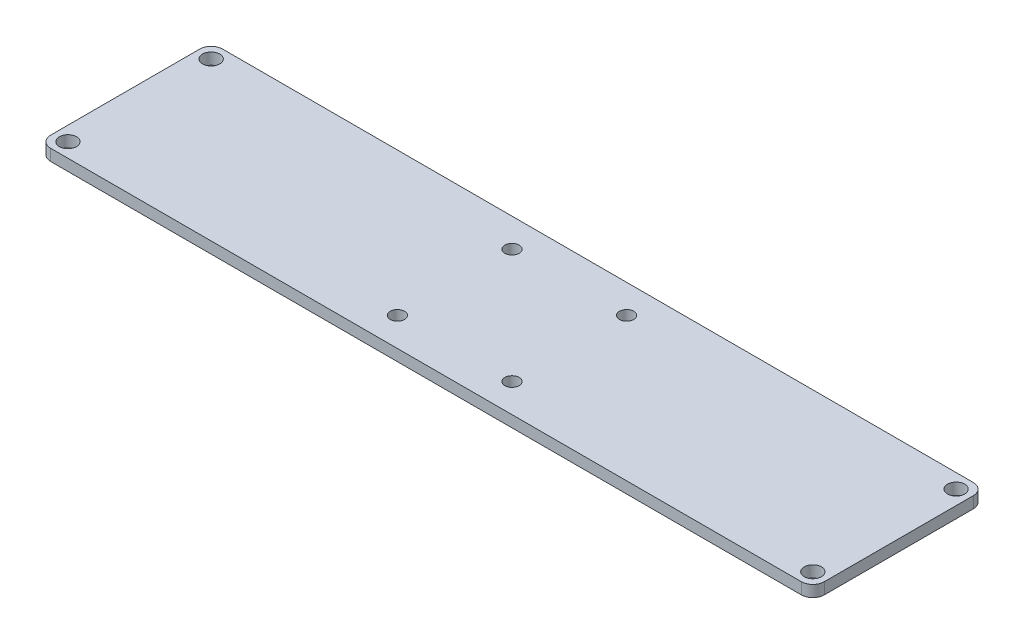
ISO-10303-21;
HEADER;
FILE_DESCRIPTION(('STEP AP214'),'2;1');
FILE_NAME('part.step','',(''),(''),'','','');
FILE_SCHEMA(('AUTOMOTIVE_DESIGN { 1 0 10303 214 1 1 1 1 }'));
ENDSEC;
DATA;
#1=APPLICATION_CONTEXT('core data for automotive mechanical design processes');
#2=APPLICATION_PROTOCOL_DEFINITION('international standard','automotive_design',2000,#1);
#3=PRODUCT_CONTEXT('',#1,'mechanical');
#4=PRODUCT('Part','Part','',(#3));
#5=PRODUCT_RELATED_PRODUCT_CATEGORY('part','',(#4));
#6=PRODUCT_DEFINITION_FORMATION('','',#4);
#7=PRODUCT_DEFINITION_CONTEXT('part definition',#1,'design');
#8=PRODUCT_DEFINITION('design','',#6,#7);
#9=PRODUCT_DEFINITION_SHAPE('','',#8);
#10=(LENGTH_UNIT() NAMED_UNIT(*) SI_UNIT(.MILLI.,.METRE.));
#11=(NAMED_UNIT(*) PLANE_ANGLE_UNIT() SI_UNIT($,.RADIAN.));
#12=(NAMED_UNIT(*) SI_UNIT($,.STERADIAN.) SOLID_ANGLE_UNIT());
#13=UNCERTAINTY_MEASURE_WITH_UNIT(LENGTH_MEASURE(1.E-05),#10,'distance_accuracy_value','');
#14=(GEOMETRIC_REPRESENTATION_CONTEXT(3) GLOBAL_UNCERTAINTY_ASSIGNED_CONTEXT((#13)) GLOBAL_UNIT_ASSIGNED_CONTEXT((#10,
#11,#12)) REPRESENTATION_CONTEXT('',''));
#15=CARTESIAN_POINT('',(0.,0.,0.));
#16=DIRECTION('',(0.,0.,1.));
#17=DIRECTION('',(1.,0.,0.));
#18=AXIS2_PLACEMENT_3D('',#15,#16,#17);
#19=CARTESIAN_POINT('',(0.,2.,0.));
#20=DIRECTION('',(0.,1.,0.));
#21=DIRECTION('',(0.,0.,1.));
#22=AXIS2_PLACEMENT_3D('',#19,#20,#21);
#23=PLANE('',#22);
#24=CARTESIAN_POINT('',(21.4154927387581,2.,7.94165580333156));
#25=DIRECTION('',(0.,-1.,0.));
#26=DIRECTION('',(0.,0.,-1.));
#27=AXIS2_PLACEMENT_3D('',#24,#25,#26);
#28=CIRCLE('',#27,1.25);
#29=CARTESIAN_POINT('',(21.4154927387581,2.,6.69165580333155));
#30=VERTEX_POINT('',#29);
#31=EDGE_CURVE('E240',#30,#30,#28,.T.);
#32=ORIENTED_EDGE('',*,*,#31,.T.);
#33=EDGE_LOOP('',(#32));
#34=FACE_BOUND('',#33,.T.);
#35=CARTESIAN_POINT('',(1.41549273875813,2.,-12.0583441966684));
#36=DIRECTION('',(0.,-1.,0.));
#37=DIRECTION('',(0.,0.,-1.));
#38=AXIS2_PLACEMENT_3D('',#35,#36,#37);
#39=CIRCLE('',#38,1.25);
#40=CARTESIAN_POINT('',(1.41549273875813,2.,-13.3083441966684));
#41=VERTEX_POINT('',#40);
#42=EDGE_CURVE('E248',#41,#41,#39,.T.);
#43=ORIENTED_EDGE('',*,*,#42,.T.);
#44=EDGE_LOOP('',(#43));
#45=FACE_BOUND('',#44,.T.);
#46=CARTESIAN_POINT('',(21.4154927387581,2.,-12.0583441966684));
#47=DIRECTION('',(0.,-1.,0.));
#48=DIRECTION('',(0.,0.,-1.));
#49=AXIS2_PLACEMENT_3D('',#46,#47,#48);
#50=CIRCLE('',#49,1.25);
#51=CARTESIAN_POINT('',(21.4154927387581,2.,-13.3083441966684));
#52=VERTEX_POINT('',#51);
#53=EDGE_CURVE('E249',#52,#52,#50,.T.);
#54=ORIENTED_EDGE('',*,*,#53,.T.);
#55=EDGE_LOOP('',(#54));
#56=FACE_BOUND('',#55,.T.);
#57=CARTESIAN_POINT('',(1.41549273875813,2.,7.94165580333156));
#58=DIRECTION('',(0.,-1.,0.));
#59=DIRECTION('',(0.,0.,-1.));
#60=AXIS2_PLACEMENT_3D('',#57,#58,#59);
#61=CIRCLE('',#60,1.25);
#62=CARTESIAN_POINT('',(1.41549273875813,2.,6.69165580333155));
#63=VERTEX_POINT('',#62);
#64=EDGE_CURVE('E232',#63,#63,#61,.T.);
#65=ORIENTED_EDGE('',*,*,#64,.T.);
#66=EDGE_LOOP('',(#65));
#67=FACE_BOUND('',#66,.T.);
#68=CARTESIAN_POINT('',(76.4154927387581,2.,-14.5583441966684));
#69=DIRECTION('',(0.,1.,0.));
#70=DIRECTION('',(0.,0.,1.));
#71=AXIS2_PLACEMENT_3D('',#68,#69,#70);
#72=CIRCLE('',#71,1.5);
#73=CARTESIAN_POINT('',(76.4154927387581,2.,-13.0583441966684));
#74=VERTEX_POINT('',#73);
#75=EDGE_CURVE('E216',#74,#74,#72,.T.);
#76=ORIENTED_EDGE('',*,*,#75,.F.);
#77=EDGE_LOOP('',(#76));
#78=FACE_BOUND('',#77,.T.);
#79=CARTESIAN_POINT('',(-53.5845072612419,2.,-14.5583441966684));
#80=DIRECTION('',(0.,1.,0.));
#81=DIRECTION('',(0.,0.,1.));
#82=AXIS2_PLACEMENT_3D('',#79,#80,#81);
#83=CIRCLE('',#82,1.5);
#84=CARTESIAN_POINT('',(-53.5845072612419,2.,-13.0583441966684));
#85=VERTEX_POINT('',#84);
#86=EDGE_CURVE('E192',#85,#85,#83,.T.);
#87=ORIENTED_EDGE('',*,*,#86,.F.);
#88=EDGE_LOOP('',(#87));
#89=FACE_BOUND('',#88,.T.);
#90=DIRECTION('',(0.,0.,-1.));
#91=VECTOR('',#90,1.);
#92=CARTESIAN_POINT('',(78.9154927387581,2.,-17.0583441966684));
#93=LINE('',#92,#91);
#94=CARTESIAN_POINT('',(78.9154927387581,2.,10.9416558033316));
#95=VERTEX_POINT('',#94);
#96=CARTESIAN_POINT('',(78.9154927387581,2.,-15.0583441966684));
#97=VERTEX_POINT('',#96);
#98=EDGE_CURVE('E202',#95,#97,#93,.T.);
#99=ORIENTED_EDGE('',*,*,#98,.T.);
#100=CARTESIAN_POINT('',(76.9154927387581,2.,-15.0583441966684));
#101=DIRECTION('',(0.,1.,0.));
#102=DIRECTION('',(0.,0.,1.));
#103=AXIS2_PLACEMENT_3D('',#100,#101,#102);
#104=CIRCLE('',#103,2.);
#105=CARTESIAN_POINT('',(76.9154927387581,2.,-17.0583441966684));
#106=VERTEX_POINT('',#105);
#107=EDGE_CURVE('E171',#97,#106,#104,.T.);
#108=ORIENTED_EDGE('',*,*,#107,.T.);
#109=DIRECTION('',(-1.,0.,0.));
#110=VECTOR('',#109,1.);
#111=CARTESIAN_POINT('',(-56.0845072612419,2.,-17.0583441966684));
#112=LINE('',#111,#110);
#113=CARTESIAN_POINT('',(-54.0845072612419,2.,-17.0583441966684));
#114=VERTEX_POINT('',#113);
#115=EDGE_CURVE('E129',#106,#114,#112,.T.);
#116=ORIENTED_EDGE('',*,*,#115,.T.);
#117=CARTESIAN_POINT('',(-54.0845072612419,2.,-15.0583441966684));
#118=DIRECTION('',(0.,1.,0.));
#119=DIRECTION('',(0.,0.,1.));
#120=AXIS2_PLACEMENT_3D('',#117,#118,#119);
#121=CIRCLE('',#120,2.);
#122=CARTESIAN_POINT('',(-56.0845072612419,2.,-15.0583441966684));
#123=VERTEX_POINT('',#122);
#124=EDGE_CURVE('E163',#114,#123,#121,.T.);
#125=ORIENTED_EDGE('',*,*,#124,.T.);
#126=DIRECTION('',(0.,0.,1.));
#127=VECTOR('',#126,1.);
#128=CARTESIAN_POINT('',(-56.0845072612419,2.,-17.0583441966684));
#129=LINE('',#128,#127);
#130=CARTESIAN_POINT('',(-56.0845072612419,2.,10.9416558033316));
#131=VERTEX_POINT('',#130);
#132=EDGE_CURVE('E138',#123,#131,#129,.T.);
#133=ORIENTED_EDGE('',*,*,#132,.T.);
#134=CARTESIAN_POINT('',(-54.0845072612419,2.,10.9416558033316));
#135=DIRECTION('',(0.,1.,0.));
#136=DIRECTION('',(0.,0.,1.));
#137=AXIS2_PLACEMENT_3D('',#134,#135,#136);
#138=CIRCLE('',#137,2.);
#139=CARTESIAN_POINT('',(-54.0845072612419,2.,12.9416558033316));
#140=VERTEX_POINT('',#139);
#141=EDGE_CURVE('E64',#131,#140,#138,.T.);
#142=ORIENTED_EDGE('',*,*,#141,.T.);
#143=DIRECTION('',(1.,0.,0.));
#144=VECTOR('',#143,1.);
#145=CARTESIAN_POINT('',(-56.0845072612419,2.,12.9416558033316));
#146=LINE('',#145,#144);
#147=CARTESIAN_POINT('',(76.9154927387582,2.,12.9416558033316));
#148=VERTEX_POINT('',#147);
#149=EDGE_CURVE('E143',#140,#148,#146,.T.);
#150=ORIENTED_EDGE('',*,*,#149,.T.);
#151=CARTESIAN_POINT('',(76.9154927387581,2.,10.9416558033316));
#152=DIRECTION('',(0.,1.,0.));
#153=DIRECTION('',(0.,0.,1.));
#154=AXIS2_PLACEMENT_3D('',#151,#152,#153);
#155=CIRCLE('',#154,2.);
#156=EDGE_CURVE('E168',#148,#95,#155,.T.);
#157=ORIENTED_EDGE('',*,*,#156,.T.);
#158=EDGE_LOOP('',(#99,#108,#116,#125,#133,#142,#150,#157));
#159=FACE_BOUND('',#158,.T.);
#160=CARTESIAN_POINT('',(-53.5845072612419,2.,10.4416558033316));
#161=DIRECTION('',(0.,1.,0.));
#162=DIRECTION('',(0.,0.,1.));
#163=AXIS2_PLACEMENT_3D('',#160,#161,#162);
#164=CIRCLE('',#163,1.5);
#165=CARTESIAN_POINT('',(-53.5845072612419,2.,11.9416558033316));
#166=VERTEX_POINT('',#165);
#167=EDGE_CURVE('E210',#166,#166,#164,.T.);
#168=ORIENTED_EDGE('',*,*,#167,.F.);
#169=EDGE_LOOP('',(#168));
#170=FACE_BOUND('',#169,.T.);
#171=CARTESIAN_POINT('',(76.4154927387581,2.,10.4416558033316));
#172=DIRECTION('',(0.,1.,0.));
#173=DIRECTION('',(0.,0.,1.));
#174=AXIS2_PLACEMENT_3D('',#171,#172,#173);
#175=CIRCLE('',#174,1.5);
#176=CARTESIAN_POINT('',(76.4154927387581,2.,11.9416558033316));
#177=VERTEX_POINT('',#176);
#178=EDGE_CURVE('E224',#177,#177,#175,.T.);
#179=ORIENTED_EDGE('',*,*,#178,.F.);
#180=EDGE_LOOP('',(#179));
#181=FACE_BOUND('',#180,.T.);
#182=ADVANCED_FACE('F41',(#34,#45,#56,#67,#78,#89,#159,#170,#181),#23,.T.);
#183=CARTESIAN_POINT('',(0.,0.,0.));
#184=DIRECTION('',(0.,1.,0.));
#185=DIRECTION('',(0.,0.,1.));
#186=AXIS2_PLACEMENT_3D('',#183,#184,#185);
#187=PLANE('',#186);
#188=CARTESIAN_POINT('',(21.4154927387581,0.,7.94165580333156));
#189=DIRECTION('',(0.,-1.,0.));
#190=DIRECTION('',(0.,0.,-1.));
#191=AXIS2_PLACEMENT_3D('',#188,#189,#190);
#192=CIRCLE('',#191,1.25);
#193=CARTESIAN_POINT('',(21.4154927387581,0.,6.69165580333155));
#194=VERTEX_POINT('',#193);
#195=EDGE_CURVE('E253',#194,#194,#192,.T.);
#196=ORIENTED_EDGE('',*,*,#195,.F.);
#197=EDGE_LOOP('',(#196));
#198=FACE_BOUND('',#197,.T.);
#199=CARTESIAN_POINT('',(1.41549273875813,0.,-12.0583441966684));
#200=DIRECTION('',(0.,-1.,0.));
#201=DIRECTION('',(0.,0.,-1.));
#202=AXIS2_PLACEMENT_3D('',#199,#200,#201);
#203=CIRCLE('',#202,1.25);
#204=CARTESIAN_POINT('',(1.41549273875813,0.,-13.3083441966684));
#205=VERTEX_POINT('',#204);
#206=EDGE_CURVE('E244',#205,#205,#203,.T.);
#207=ORIENTED_EDGE('',*,*,#206,.F.);
#208=EDGE_LOOP('',(#207));
#209=FACE_BOUND('',#208,.T.);
#210=CARTESIAN_POINT('',(21.4154927387581,0.,-12.0583441966684));
#211=DIRECTION('',(0.,-1.,0.));
#212=DIRECTION('',(0.,0.,-1.));
#213=AXIS2_PLACEMENT_3D('',#210,#211,#212);
#214=CIRCLE('',#213,1.25);
#215=CARTESIAN_POINT('',(21.4154927387581,0.,-13.3083441966684));
#216=VERTEX_POINT('',#215);
#217=EDGE_CURVE('E260',#216,#216,#214,.T.);
#218=ORIENTED_EDGE('',*,*,#217,.F.);
#219=EDGE_LOOP('',(#218));
#220=FACE_BOUND('',#219,.T.);
#221=CARTESIAN_POINT('',(1.41549273875813,0.,7.94165580333156));
#222=DIRECTION('',(0.,-1.,0.));
#223=DIRECTION('',(0.,0.,-1.));
#224=AXIS2_PLACEMENT_3D('',#221,#222,#223);
#225=CIRCLE('',#224,1.25);
#226=CARTESIAN_POINT('',(1.41549273875813,0.,6.69165580333155));
#227=VERTEX_POINT('',#226);
#228=EDGE_CURVE('E236',#227,#227,#225,.T.);
#229=ORIENTED_EDGE('',*,*,#228,.F.);
#230=EDGE_LOOP('',(#229));
#231=FACE_BOUND('',#230,.T.);
#232=DIRECTION('',(-1.,0.,0.));
#233=VECTOR('',#232,1.);
#234=CARTESIAN_POINT('',(-56.0845072612419,0.,-17.0583441966684));
#235=LINE('',#234,#233);
#236=CARTESIAN_POINT('',(76.9154927387581,0.,-17.0583441966684));
#237=VERTEX_POINT('',#236);
#238=CARTESIAN_POINT('',(-54.0845072612419,0.,-17.0583441966684));
#239=VERTEX_POINT('',#238);
#240=EDGE_CURVE('E126',#237,#239,#235,.T.);
#241=ORIENTED_EDGE('',*,*,#240,.F.);
#242=CARTESIAN_POINT('',(76.9154927387581,0.,-15.0583441966684));
#243=DIRECTION('',(0.,1.,0.));
#244=DIRECTION('',(0.,0.,1.));
#245=AXIS2_PLACEMENT_3D('',#242,#243,#244);
#246=CIRCLE('',#245,2.);
#247=CARTESIAN_POINT('',(78.9154927387581,0.,-15.0583441966684));
#248=VERTEX_POINT('',#247);
#249=EDGE_CURVE('E108',#237,#248,#246,.F.);
#250=ORIENTED_EDGE('',*,*,#249,.T.);
#251=DIRECTION('',(0.,0.,-1.));
#252=VECTOR('',#251,1.);
#253=CARTESIAN_POINT('',(78.9154927387581,0.,-17.0583441966684));
#254=LINE('',#253,#252);
#255=CARTESIAN_POINT('',(78.9154927387581,0.,10.9416558033316));
#256=VERTEX_POINT('',#255);
#257=EDGE_CURVE('E139',#256,#248,#254,.T.);
#258=ORIENTED_EDGE('',*,*,#257,.F.);
#259=CARTESIAN_POINT('',(76.9154927387581,0.,10.9416558033316));
#260=DIRECTION('',(0.,1.,0.));
#261=DIRECTION('',(0.,0.,1.));
#262=AXIS2_PLACEMENT_3D('',#259,#260,#261);
#263=CIRCLE('',#262,2.);
#264=CARTESIAN_POINT('',(76.9154927387582,0.,12.9416558033316));
#265=VERTEX_POINT('',#264);
#266=EDGE_CURVE('E120',#256,#265,#263,.F.);
#267=ORIENTED_EDGE('',*,*,#266,.T.);
#268=DIRECTION('',(1.,0.,0.));
#269=VECTOR('',#268,1.);
#270=CARTESIAN_POINT('',(-56.0845072612419,0.,12.9416558033316));
#271=LINE('',#270,#269);
#272=CARTESIAN_POINT('',(-54.0845072612419,0.,12.9416558033316));
#273=VERTEX_POINT('',#272);
#274=EDGE_CURVE('E145',#273,#265,#271,.T.);
#275=ORIENTED_EDGE('',*,*,#274,.F.);
#276=CARTESIAN_POINT('',(-54.0845072612419,0.,10.9416558033316));
#277=DIRECTION('',(0.,1.,0.));
#278=DIRECTION('',(0.,0.,1.));
#279=AXIS2_PLACEMENT_3D('',#276,#277,#278);
#280=CIRCLE('',#279,2.);
#281=CARTESIAN_POINT('',(-56.0845072612419,0.,10.9416558033316));
#282=VERTEX_POINT('',#281);
#283=EDGE_CURVE('E153',#273,#282,#280,.F.);
#284=ORIENTED_EDGE('',*,*,#283,.T.);
#285=DIRECTION('',(0.,0.,1.));
#286=VECTOR('',#285,1.);
#287=CARTESIAN_POINT('',(-56.0845072612419,0.,-17.0583441966684));
#288=LINE('',#287,#286);
#289=CARTESIAN_POINT('',(-56.0845072612419,0.,-15.0583441966684));
#290=VERTEX_POINT('',#289);
#291=EDGE_CURVE('E186',#290,#282,#288,.T.);
#292=ORIENTED_EDGE('',*,*,#291,.F.);
#293=CARTESIAN_POINT('',(-54.0845072612419,0.,-15.0583441966684));
#294=DIRECTION('',(0.,1.,0.));
#295=DIRECTION('',(0.,0.,1.));
#296=AXIS2_PLACEMENT_3D('',#293,#294,#295);
#297=CIRCLE('',#296,2.);
#298=EDGE_CURVE('E131',#290,#239,#297,.F.);
#299=ORIENTED_EDGE('',*,*,#298,.T.);
#300=EDGE_LOOP('',(#241,#250,#258,#267,#275,#284,#292,#299));
#301=FACE_BOUND('',#300,.T.);
#302=CARTESIAN_POINT('',(-53.5845072612419,0.,-14.5583441966684));
#303=DIRECTION('',(0.,1.,0.));
#304=DIRECTION('',(0.,0.,1.));
#305=AXIS2_PLACEMENT_3D('',#302,#303,#304);
#306=CIRCLE('',#305,1.5);
#307=CARTESIAN_POINT('',(-53.5845072612419,0.,-13.0583441966684));
#308=VERTEX_POINT('',#307);
#309=EDGE_CURVE('E197',#308,#308,#306,.T.);
#310=ORIENTED_EDGE('',*,*,#309,.T.);
#311=EDGE_LOOP('',(#310));
#312=FACE_BOUND('',#311,.T.);
#313=CARTESIAN_POINT('',(-53.5845072612419,0.,10.4416558033316));
#314=DIRECTION('',(0.,1.,0.));
#315=DIRECTION('',(0.,0.,1.));
#316=AXIS2_PLACEMENT_3D('',#313,#314,#315);
#317=CIRCLE('',#316,1.5);
#318=CARTESIAN_POINT('',(-53.5845072612419,0.,11.9416558033316));
#319=VERTEX_POINT('',#318);
#320=EDGE_CURVE('E212',#319,#319,#317,.T.);
#321=ORIENTED_EDGE('',*,*,#320,.T.);
#322=EDGE_LOOP('',(#321));
#323=FACE_BOUND('',#322,.T.);
#324=CARTESIAN_POINT('',(76.4154927387581,0.,-14.5583441966684));
#325=DIRECTION('',(0.,1.,0.));
#326=DIRECTION('',(0.,0.,1.));
#327=AXIS2_PLACEMENT_3D('',#324,#325,#326);
#328=CIRCLE('',#327,1.5);
#329=CARTESIAN_POINT('',(76.4154927387581,0.,-13.0583441966684));
#330=VERTEX_POINT('',#329);
#331=EDGE_CURVE('E220',#330,#330,#328,.T.);
#332=ORIENTED_EDGE('',*,*,#331,.T.);
#333=EDGE_LOOP('',(#332));
#334=FACE_BOUND('',#333,.T.);
#335=CARTESIAN_POINT('',(76.4154927387581,0.,10.4416558033316));
#336=DIRECTION('',(0.,1.,0.));
#337=DIRECTION('',(0.,0.,1.));
#338=AXIS2_PLACEMENT_3D('',#335,#336,#337);
#339=CIRCLE('',#338,1.5);
#340=CARTESIAN_POINT('',(76.4154927387581,0.,11.9416558033316));
#341=VERTEX_POINT('',#340);
#342=EDGE_CURVE('E228',#341,#341,#339,.T.);
#343=ORIENTED_EDGE('',*,*,#342,.T.);
#344=EDGE_LOOP('',(#343));
#345=FACE_BOUND('',#344,.T.);
#346=ADVANCED_FACE('F134',(#198,#209,#220,#231,#301,#312,#323,#334,#345),#187,.F.);
#347=CARTESIAN_POINT('',(-56.0845072612419,2.,-17.0583441966684));
#348=DIRECTION('',(1.,0.,0.));
#349=DIRECTION('',(0.,0.,-1.));
#350=AXIS2_PLACEMENT_3D('',#347,#348,#349);
#351=PLANE('',#350);
#352=ORIENTED_EDGE('',*,*,#291,.T.);
#353=DIRECTION('',(0.,-1.,0.));
#354=VECTOR('',#353,1.);
#355=CARTESIAN_POINT('',(-56.0845072612419,2.,10.9416558033316));
#356=LINE('',#355,#354);
#357=EDGE_CURVE('E11',#282,#131,#356,.F.);
#358=ORIENTED_EDGE('',*,*,#357,.T.);
#359=ORIENTED_EDGE('',*,*,#132,.F.);
#360=DIRECTION('',(0.,-1.,0.));
#361=VECTOR('',#360,1.);
#362=CARTESIAN_POINT('',(-56.0845072612419,2.,-15.0583441966684));
#363=LINE('',#362,#361);
#364=EDGE_CURVE('E50',#123,#290,#363,.T.);
#365=ORIENTED_EDGE('',*,*,#364,.T.);
#366=EDGE_LOOP('',(#352,#358,#359,#365));
#367=FACE_BOUND('',#366,.T.);
#368=ADVANCED_FACE('F185',(#367),#351,.F.);
#369=CARTESIAN_POINT('',(-56.0845072612419,2.,12.9416558033316));
#370=DIRECTION('',(0.,0.,-1.));
#371=DIRECTION('',(-1.,0.,0.));
#372=AXIS2_PLACEMENT_3D('',#369,#370,#371);
#373=PLANE('',#372);
#374=ORIENTED_EDGE('',*,*,#274,.T.);
#375=DIRECTION('',(0.,-1.,0.));
#376=VECTOR('',#375,1.);
#377=CARTESIAN_POINT('',(76.9154927387582,2.,12.9416558033316));
#378=LINE('',#377,#376);
#379=EDGE_CURVE('E57',#265,#148,#378,.F.);
#380=ORIENTED_EDGE('',*,*,#379,.T.);
#381=ORIENTED_EDGE('',*,*,#149,.F.);
#382=DIRECTION('',(0.,-1.,0.));
#383=VECTOR('',#382,1.);
#384=CARTESIAN_POINT('',(-54.0845072612419,2.,12.9416558033316));
#385=LINE('',#384,#383);
#386=EDGE_CURVE('E174',#140,#273,#385,.T.);
#387=ORIENTED_EDGE('',*,*,#386,.T.);
#388=EDGE_LOOP('',(#374,#380,#381,#387));
#389=FACE_BOUND('',#388,.T.);
#390=ADVANCED_FACE('F309',(#389),#373,.F.);
#391=CARTESIAN_POINT('',(78.9154927387581,2.,-17.0583441966684));
#392=DIRECTION('',(-1.,0.,0.));
#393=DIRECTION('',(0.,0.,1.));
#394=AXIS2_PLACEMENT_3D('',#391,#392,#393);
#395=PLANE('',#394);
#396=ORIENTED_EDGE('',*,*,#257,.T.);
#397=DIRECTION('',(0.,-1.,0.));
#398=VECTOR('',#397,1.);
#399=CARTESIAN_POINT('',(78.9154927387581,2.,-15.0583441966684));
#400=LINE('',#399,#398);
#401=EDGE_CURVE('E113',#248,#97,#400,.F.);
#402=ORIENTED_EDGE('',*,*,#401,.T.);
#403=ORIENTED_EDGE('',*,*,#98,.F.);
#404=DIRECTION('',(0.,-1.,0.));
#405=VECTOR('',#404,1.);
#406=CARTESIAN_POINT('',(78.9154927387581,2.,10.9416558033316));
#407=LINE('',#406,#405);
#408=EDGE_CURVE('E119',#95,#256,#407,.T.);
#409=ORIENTED_EDGE('',*,*,#408,.T.);
#410=EDGE_LOOP('',(#396,#402,#403,#409));
#411=FACE_BOUND('',#410,.T.);
#412=ADVANCED_FACE('F306',(#411),#395,.F.);
#413=CARTESIAN_POINT('',(-56.0845072612419,2.,-17.0583441966684));
#414=DIRECTION('',(0.,0.,1.));
#415=DIRECTION('',(1.,0.,0.));
#416=AXIS2_PLACEMENT_3D('',#413,#414,#415);
#417=PLANE('',#416);
#418=ORIENTED_EDGE('',*,*,#115,.F.);
#419=DIRECTION('',(0.,-1.,0.));
#420=VECTOR('',#419,1.);
#421=CARTESIAN_POINT('',(76.9154927387581,2.,-17.0583441966684));
#422=LINE('',#421,#420);
#423=EDGE_CURVE('E112',#106,#237,#422,.T.);
#424=ORIENTED_EDGE('',*,*,#423,.T.);
#425=ORIENTED_EDGE('',*,*,#240,.T.);
#426=DIRECTION('',(0.,-1.,0.));
#427=VECTOR('',#426,1.);
#428=CARTESIAN_POINT('',(-54.0845072612419,2.,-17.0583441966684));
#429=LINE('',#428,#427);
#430=EDGE_CURVE('E132',#239,#114,#429,.F.);
#431=ORIENTED_EDGE('',*,*,#430,.T.);
#432=EDGE_LOOP('',(#418,#424,#425,#431));
#433=FACE_BOUND('',#432,.T.);
#434=ADVANCED_FACE('F125',(#433),#417,.F.);
#435=CARTESIAN_POINT('',(-53.5845072612419,2.,-14.5583441966684));
#436=DIRECTION('',(0.,-1.,0.));
#437=DIRECTION('',(0.,0.,-1.));
#438=AXIS2_PLACEMENT_3D('',#435,#436,#437);
#439=CYLINDRICAL_SURFACE('',#438,1.5);
#440=ORIENTED_EDGE('',*,*,#86,.T.);
#441=EDGE_LOOP('',(#440));
#442=FACE_BOUND('',#441,.T.);
#443=ORIENTED_EDGE('',*,*,#309,.F.);
#444=EDGE_LOOP('',(#443));
#445=FACE_BOUND('',#444,.T.);
#446=ADVANCED_FACE('F301',(#442,#445),#439,.F.);
#447=CARTESIAN_POINT('',(-53.5845072612419,2.,10.4416558033316));
#448=DIRECTION('',(0.,-1.,0.));
#449=DIRECTION('',(0.,0.,-1.));
#450=AXIS2_PLACEMENT_3D('',#447,#448,#449);
#451=CYLINDRICAL_SURFACE('',#450,1.5);
#452=ORIENTED_EDGE('',*,*,#167,.T.);
#453=EDGE_LOOP('',(#452));
#454=FACE_BOUND('',#453,.T.);
#455=ORIENTED_EDGE('',*,*,#320,.F.);
#456=EDGE_LOOP('',(#455));
#457=FACE_BOUND('',#456,.T.);
#458=ADVANCED_FACE('F342',(#454,#457),#451,.F.);
#459=CARTESIAN_POINT('',(76.4154927387581,2.,-14.5583441966684));
#460=DIRECTION('',(0.,-1.,0.));
#461=DIRECTION('',(0.,0.,-1.));
#462=AXIS2_PLACEMENT_3D('',#459,#460,#461);
#463=CYLINDRICAL_SURFACE('',#462,1.5);
#464=ORIENTED_EDGE('',*,*,#75,.T.);
#465=EDGE_LOOP('',(#464));
#466=FACE_BOUND('',#465,.T.);
#467=ORIENTED_EDGE('',*,*,#331,.F.);
#468=EDGE_LOOP('',(#467));
#469=FACE_BOUND('',#468,.T.);
#470=ADVANCED_FACE('F336',(#466,#469),#463,.F.);
#471=CARTESIAN_POINT('',(76.4154927387581,2.,10.4416558033316));
#472=DIRECTION('',(0.,-1.,0.));
#473=DIRECTION('',(0.,0.,-1.));
#474=AXIS2_PLACEMENT_3D('',#471,#472,#473);
#475=CYLINDRICAL_SURFACE('',#474,1.5);
#476=ORIENTED_EDGE('',*,*,#178,.T.);
#477=EDGE_LOOP('',(#476));
#478=FACE_BOUND('',#477,.T.);
#479=ORIENTED_EDGE('',*,*,#342,.F.);
#480=EDGE_LOOP('',(#479));
#481=FACE_BOUND('',#480,.T.);
#482=ADVANCED_FACE('F318',(#478,#481),#475,.F.);
#483=CARTESIAN_POINT('',(76.9154927387581,2.,-15.0583441966684));
#484=DIRECTION('',(0.,-1.,0.));
#485=DIRECTION('',(0.,0.,-1.));
#486=AXIS2_PLACEMENT_3D('',#483,#484,#485);
#487=CYLINDRICAL_SURFACE('',#486,2.);
#488=ORIENTED_EDGE('',*,*,#107,.F.);
#489=ORIENTED_EDGE('',*,*,#401,.F.);
#490=ORIENTED_EDGE('',*,*,#249,.F.);
#491=ORIENTED_EDGE('',*,*,#423,.F.);
#492=EDGE_LOOP('',(#488,#489,#490,#491));
#493=FACE_BOUND('',#492,.T.);
#494=ADVANCED_FACE('F111',(#493),#487,.T.);
#495=CARTESIAN_POINT('',(76.9154927387581,2.,10.9416558033316));
#496=DIRECTION('',(0.,-1.,0.));
#497=DIRECTION('',(0.,0.,-1.));
#498=AXIS2_PLACEMENT_3D('',#495,#496,#497);
#499=CYLINDRICAL_SURFACE('',#498,2.);
#500=ORIENTED_EDGE('',*,*,#156,.F.);
#501=ORIENTED_EDGE('',*,*,#379,.F.);
#502=ORIENTED_EDGE('',*,*,#266,.F.);
#503=ORIENTED_EDGE('',*,*,#408,.F.);
#504=EDGE_LOOP('',(#500,#501,#502,#503));
#505=FACE_BOUND('',#504,.T.);
#506=ADVANCED_FACE('F317',(#505),#499,.T.);
#507=CARTESIAN_POINT('',(-54.0845072612419,2.,10.9416558033316));
#508=DIRECTION('',(0.,-1.,0.));
#509=DIRECTION('',(0.,0.,-1.));
#510=AXIS2_PLACEMENT_3D('',#507,#508,#509);
#511=CYLINDRICAL_SURFACE('',#510,2.);
#512=ORIENTED_EDGE('',*,*,#141,.F.);
#513=ORIENTED_EDGE('',*,*,#357,.F.);
#514=ORIENTED_EDGE('',*,*,#283,.F.);
#515=ORIENTED_EDGE('',*,*,#386,.F.);
#516=EDGE_LOOP('',(#512,#513,#514,#515));
#517=FACE_BOUND('',#516,.T.);
#518=ADVANCED_FACE('F290',(#517),#511,.T.);
#519=CARTESIAN_POINT('',(-54.0845072612419,2.,-15.0583441966684));
#520=DIRECTION('',(0.,-1.,0.));
#521=DIRECTION('',(0.,0.,-1.));
#522=AXIS2_PLACEMENT_3D('',#519,#520,#521);
#523=CYLINDRICAL_SURFACE('',#522,2.);
#524=ORIENTED_EDGE('',*,*,#124,.F.);
#525=ORIENTED_EDGE('',*,*,#430,.F.);
#526=ORIENTED_EDGE('',*,*,#298,.F.);
#527=ORIENTED_EDGE('',*,*,#364,.F.);
#528=EDGE_LOOP('',(#524,#525,#526,#527));
#529=FACE_BOUND('',#528,.T.);
#530=ADVANCED_FACE('F43',(#529),#523,.T.);
#531=CARTESIAN_POINT('',(1.41549273875813,2.,7.94165580333156));
#532=DIRECTION('',(0.,-1.,0.));
#533=DIRECTION('',(0.,0.,-1.));
#534=AXIS2_PLACEMENT_3D('',#531,#532,#533);
#535=CYLINDRICAL_SURFACE('',#534,1.25);
#536=ORIENTED_EDGE('',*,*,#64,.F.);
#537=EDGE_LOOP('',(#536));
#538=FACE_BOUND('',#537,.T.);
#539=ORIENTED_EDGE('',*,*,#228,.T.);
#540=EDGE_LOOP('',(#539));
#541=FACE_BOUND('',#540,.T.);
#542=ADVANCED_FACE('F274',(#538,#541),#535,.F.);
#543=CARTESIAN_POINT('',(21.4154927387581,2.,-12.0583441966684));
#544=DIRECTION('',(0.,-1.,0.));
#545=DIRECTION('',(0.,0.,-1.));
#546=AXIS2_PLACEMENT_3D('',#543,#544,#545);
#547=CYLINDRICAL_SURFACE('',#546,1.25);
#548=ORIENTED_EDGE('',*,*,#53,.F.);
#549=EDGE_LOOP('',(#548));
#550=FACE_BOUND('',#549,.T.);
#551=ORIENTED_EDGE('',*,*,#217,.T.);
#552=EDGE_LOOP('',(#551));
#553=FACE_BOUND('',#552,.T.);
#554=ADVANCED_FACE('F270',(#550,#553),#547,.F.);
#555=CARTESIAN_POINT('',(1.41549273875813,2.,-12.0583441966684));
#556=DIRECTION('',(0.,-1.,0.));
#557=DIRECTION('',(0.,0.,-1.));
#558=AXIS2_PLACEMENT_3D('',#555,#556,#557);
#559=CYLINDRICAL_SURFACE('',#558,1.25);
#560=ORIENTED_EDGE('',*,*,#42,.F.);
#561=EDGE_LOOP('',(#560));
#562=FACE_BOUND('',#561,.T.);
#563=ORIENTED_EDGE('',*,*,#206,.T.);
#564=EDGE_LOOP('',(#563));
#565=FACE_BOUND('',#564,.T.);
#566=ADVANCED_FACE('F273',(#562,#565),#559,.F.);
#567=CARTESIAN_POINT('',(21.4154927387581,2.,7.94165580333156));
#568=DIRECTION('',(0.,-1.,0.));
#569=DIRECTION('',(0.,0.,-1.));
#570=AXIS2_PLACEMENT_3D('',#567,#568,#569);
#571=CYLINDRICAL_SURFACE('',#570,1.25);
#572=ORIENTED_EDGE('',*,*,#31,.F.);
#573=EDGE_LOOP('',(#572));
#574=FACE_BOUND('',#573,.T.);
#575=ORIENTED_EDGE('',*,*,#195,.T.);
#576=EDGE_LOOP('',(#575));
#577=FACE_BOUND('',#576,.T.);
#578=ADVANCED_FACE('F407',(#574,#577),#571,.F.);
#579=CLOSED_SHELL('',(#182,#346,#368,#390,#412,#434,#446,#458,#470,#482,#494,#506,#518,#530,
#542,#554,#566,#578));
#580=MANIFOLD_SOLID_BREP('B2',#579);
#581=ADVANCED_BREP_SHAPE_REPRESENTATION('',(#18,#580),#14);
#582=SHAPE_DEFINITION_REPRESENTATION(#9,#581);
ENDSEC;
END-ISO-10303-21;
